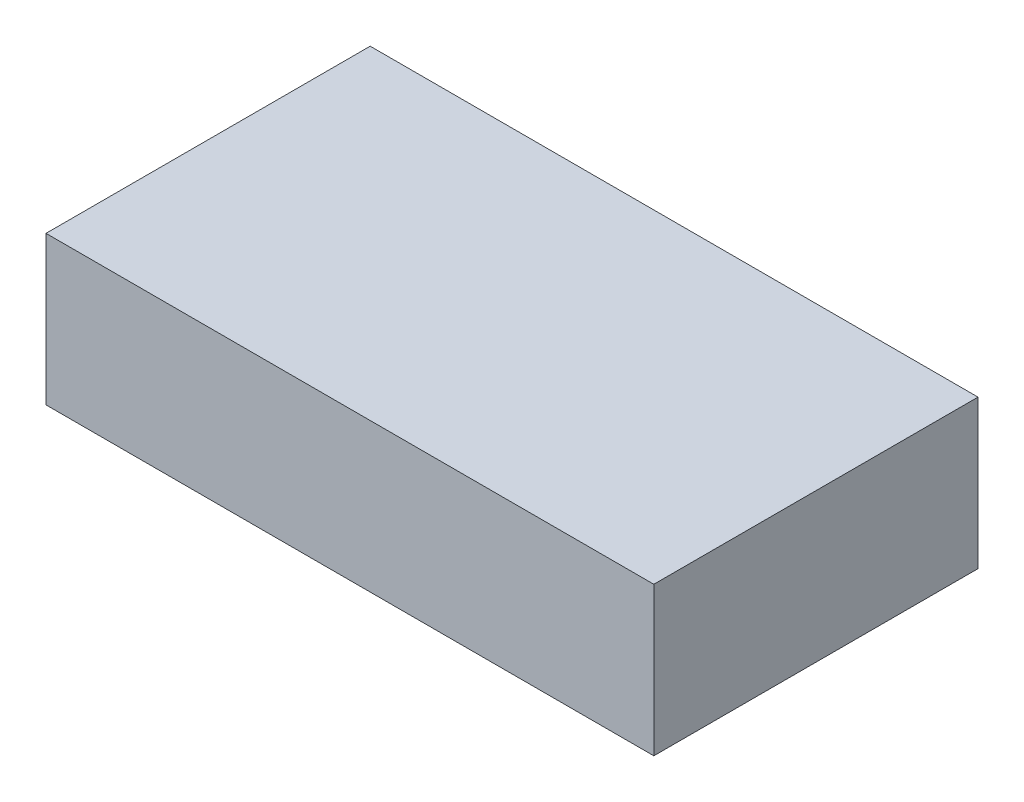
ISO-10303-21;
HEADER;
FILE_DESCRIPTION(('STEP AP214'),'2;1');
FILE_NAME('part.step','',(''),(''),'','','');
FILE_SCHEMA(('AUTOMOTIVE_DESIGN { 1 0 10303 214 1 1 1 1 }'));
ENDSEC;
DATA;
#1=APPLICATION_CONTEXT('core data for automotive mechanical design processes');
#2=APPLICATION_PROTOCOL_DEFINITION('international standard','automotive_design',2000,#1);
#3=PRODUCT_CONTEXT('',#1,'mechanical');
#4=PRODUCT('Part','Part','',(#3));
#5=PRODUCT_RELATED_PRODUCT_CATEGORY('part','',(#4));
#6=PRODUCT_DEFINITION_FORMATION('','',#4);
#7=PRODUCT_DEFINITION_CONTEXT('part definition',#1,'design');
#8=PRODUCT_DEFINITION('design','',#6,#7);
#9=PRODUCT_DEFINITION_SHAPE('','',#8);
#10=(LENGTH_UNIT() NAMED_UNIT(*) SI_UNIT(.MILLI.,.METRE.));
#11=(NAMED_UNIT(*) PLANE_ANGLE_UNIT() SI_UNIT($,.RADIAN.));
#12=(NAMED_UNIT(*) SI_UNIT($,.STERADIAN.) SOLID_ANGLE_UNIT());
#13=UNCERTAINTY_MEASURE_WITH_UNIT(LENGTH_MEASURE(1.E-05),#10,'distance_accuracy_value','');
#14=(GEOMETRIC_REPRESENTATION_CONTEXT(3) GLOBAL_UNCERTAINTY_ASSIGNED_CONTEXT((#13)) GLOBAL_UNIT_ASSIGNED_CONTEXT((#10,
#11,#12)) REPRESENTATION_CONTEXT('',''));
#15=CARTESIAN_POINT('',(0.,0.,0.));
#16=DIRECTION('',(0.,0.,1.));
#17=DIRECTION('',(1.,0.,0.));
#18=AXIS2_PLACEMENT_3D('',#15,#16,#17);
#19=CARTESIAN_POINT('',(0.,11.,0.));
#20=DIRECTION('',(-1.,0.,0.));
#21=DIRECTION('',(0.,0.,1.));
#22=AXIS2_PLACEMENT_3D('',#19,#20,#21);
#23=PLANE('',#22);
#24=DIRECTION('',(0.,0.,-1.));
#25=VECTOR('',#24,1.);
#26=CARTESIAN_POINT('',(0.,0.,0.));
#27=LINE('',#26,#25);
#28=CARTESIAN_POINT('',(0.,0.,0.));
#29=VERTEX_POINT('',#28);
#30=CARTESIAN_POINT('',(0.,0.,-24.000000006));
#31=VERTEX_POINT('',#30);
#32=EDGE_CURVE('E100',#29,#31,#27,.T.);
#33=ORIENTED_EDGE('',*,*,#32,.T.);
#34=DIRECTION('',(0.,-1.,0.));
#35=VECTOR('',#34,1.);
#36=CARTESIAN_POINT('',(0.,11.,-24.000000006));
#37=LINE('',#36,#35);
#38=CARTESIAN_POINT('',(0.,11.,-24.000000006));
#39=VERTEX_POINT('',#38);
#40=EDGE_CURVE('E11',#39,#31,#37,.T.);
#41=ORIENTED_EDGE('',*,*,#40,.F.);
#42=DIRECTION('',(0.,0.,-1.));
#43=VECTOR('',#42,1.);
#44=CARTESIAN_POINT('',(0.,11.,0.));
#45=LINE('',#44,#43);
#46=CARTESIAN_POINT('',(0.,11.,0.));
#47=VERTEX_POINT('',#46);
#48=EDGE_CURVE('E88',#47,#39,#45,.T.);
#49=ORIENTED_EDGE('',*,*,#48,.F.);
#50=DIRECTION('',(0.,-1.,0.));
#51=VECTOR('',#50,1.);
#52=CARTESIAN_POINT('',(0.,11.,0.));
#53=LINE('',#52,#51);
#54=EDGE_CURVE('E96',#47,#29,#53,.T.);
#55=ORIENTED_EDGE('',*,*,#54,.T.);
#56=EDGE_LOOP('',(#33,#41,#49,#55));
#57=FACE_BOUND('',#56,.T.);
#58=ADVANCED_FACE('F37',(#57),#23,.F.);
#59=CARTESIAN_POINT('',(0.,11.,-24.000000006));
#60=DIRECTION('',(0.,0.,1.));
#61=DIRECTION('',(1.,0.,0.));
#62=AXIS2_PLACEMENT_3D('',#59,#60,#61);
#63=PLANE('',#62);
#64=DIRECTION('',(-1.,0.,0.));
#65=VECTOR('',#64,1.);
#66=CARTESIAN_POINT('',(0.,0.,-24.000000006));
#67=LINE('',#66,#65);
#68=CARTESIAN_POINT('',(-45.,0.,-24.000000006));
#69=VERTEX_POINT('',#68);
#70=EDGE_CURVE('E92',#31,#69,#67,.T.);
#71=ORIENTED_EDGE('',*,*,#70,.T.);
#72=DIRECTION('',(0.,-1.,0.));
#73=VECTOR('',#72,1.);
#74=CARTESIAN_POINT('',(-45.,11.,-24.000000006));
#75=LINE('',#74,#73);
#76=CARTESIAN_POINT('',(-45.,11.,-24.000000006));
#77=VERTEX_POINT('',#76);
#78=EDGE_CURVE('E45',#77,#69,#75,.T.);
#79=ORIENTED_EDGE('',*,*,#78,.F.);
#80=DIRECTION('',(-1.,0.,0.));
#81=VECTOR('',#80,1.);
#82=CARTESIAN_POINT('',(0.,11.,-24.000000006));
#83=LINE('',#82,#81);
#84=EDGE_CURVE('E83',#39,#77,#83,.T.);
#85=ORIENTED_EDGE('',*,*,#84,.F.);
#86=ORIENTED_EDGE('',*,*,#40,.T.);
#87=EDGE_LOOP('',(#71,#79,#85,#86));
#88=FACE_BOUND('',#87,.T.);
#89=ADVANCED_FACE('F91',(#88),#63,.F.);
#90=CARTESIAN_POINT('',(-45.,11.,0.));
#91=DIRECTION('',(1.,0.,0.));
#92=DIRECTION('',(0.,0.,-1.));
#93=AXIS2_PLACEMENT_3D('',#90,#91,#92);
#94=PLANE('',#93);
#95=DIRECTION('',(0.,0.,1.));
#96=VECTOR('',#95,1.);
#97=CARTESIAN_POINT('',(-45.,0.,0.));
#98=LINE('',#97,#96);
#99=CARTESIAN_POINT('',(-45.,0.,0.));
#100=VERTEX_POINT('',#99);
#101=EDGE_CURVE('E70',#69,#100,#98,.T.);
#102=ORIENTED_EDGE('',*,*,#101,.T.);
#103=DIRECTION('',(0.,-1.,0.));
#104=VECTOR('',#103,1.);
#105=CARTESIAN_POINT('',(-45.,11.,0.));
#106=LINE('',#105,#104);
#107=CARTESIAN_POINT('',(-45.,11.,0.));
#108=VERTEX_POINT('',#107);
#109=EDGE_CURVE('E93',#108,#100,#106,.T.);
#110=ORIENTED_EDGE('',*,*,#109,.F.);
#111=DIRECTION('',(0.,0.,1.));
#112=VECTOR('',#111,1.);
#113=CARTESIAN_POINT('',(-45.,11.,0.));
#114=LINE('',#113,#112);
#115=EDGE_CURVE('E86',#77,#108,#114,.T.);
#116=ORIENTED_EDGE('',*,*,#115,.F.);
#117=ORIENTED_EDGE('',*,*,#78,.T.);
#118=EDGE_LOOP('',(#102,#110,#116,#117));
#119=FACE_BOUND('',#118,.T.);
#120=ADVANCED_FACE('F94',(#119),#94,.F.);
#121=CARTESIAN_POINT('',(0.,11.,0.));
#122=DIRECTION('',(0.,0.,-1.));
#123=DIRECTION('',(-1.,0.,0.));
#124=AXIS2_PLACEMENT_3D('',#121,#122,#123);
#125=PLANE('',#124);
#126=DIRECTION('',(1.,0.,0.));
#127=VECTOR('',#126,1.);
#128=CARTESIAN_POINT('',(0.,0.,0.));
#129=LINE('',#128,#127);
#130=EDGE_CURVE('E76',#100,#29,#129,.T.);
#131=ORIENTED_EDGE('',*,*,#130,.T.);
#132=ORIENTED_EDGE('',*,*,#54,.F.);
#133=DIRECTION('',(1.,0.,0.));
#134=VECTOR('',#133,1.);
#135=CARTESIAN_POINT('',(0.,11.,0.));
#136=LINE('',#135,#134);
#137=EDGE_CURVE('E53',#108,#47,#136,.T.);
#138=ORIENTED_EDGE('',*,*,#137,.F.);
#139=ORIENTED_EDGE('',*,*,#109,.T.);
#140=EDGE_LOOP('',(#131,#132,#138,#139));
#141=FACE_BOUND('',#140,.T.);
#142=ADVANCED_FACE('F107',(#141),#125,.F.);
#143=CARTESIAN_POINT('',(0.,11.,0.));
#144=DIRECTION('',(0.,1.,0.));
#145=DIRECTION('',(0.,0.,1.));
#146=AXIS2_PLACEMENT_3D('',#143,#144,#145);
#147=PLANE('',#146);
#148=ORIENTED_EDGE('',*,*,#48,.T.);
#149=ORIENTED_EDGE('',*,*,#84,.T.);
#150=ORIENTED_EDGE('',*,*,#115,.T.);
#151=ORIENTED_EDGE('',*,*,#137,.T.);
#152=EDGE_LOOP('',(#148,#149,#150,#151));
#153=FACE_BOUND('',#152,.T.);
#154=ADVANCED_FACE('F84',(#153),#147,.T.);
#155=CARTESIAN_POINT('',(0.,0.,0.));
#156=DIRECTION('',(0.,1.,0.));
#157=DIRECTION('',(0.,0.,1.));
#158=AXIS2_PLACEMENT_3D('',#155,#156,#157);
#159=PLANE('',#158);
#160=ORIENTED_EDGE('',*,*,#32,.F.);
#161=ORIENTED_EDGE('',*,*,#130,.F.);
#162=ORIENTED_EDGE('',*,*,#101,.F.);
#163=ORIENTED_EDGE('',*,*,#70,.F.);
#164=EDGE_LOOP('',(#160,#161,#162,#163));
#165=FACE_BOUND('',#164,.T.);
#166=ADVANCED_FACE('F110',(#165),#159,.F.);
#167=CLOSED_SHELL('',(#58,#89,#120,#142,#154,#166));
#168=MANIFOLD_SOLID_BREP('B2',#167);
#169=ADVANCED_BREP_SHAPE_REPRESENTATION('',(#18,#168),#14);
#170=SHAPE_DEFINITION_REPRESENTATION(#9,#169);
ENDSEC;
END-ISO-10303-21;
